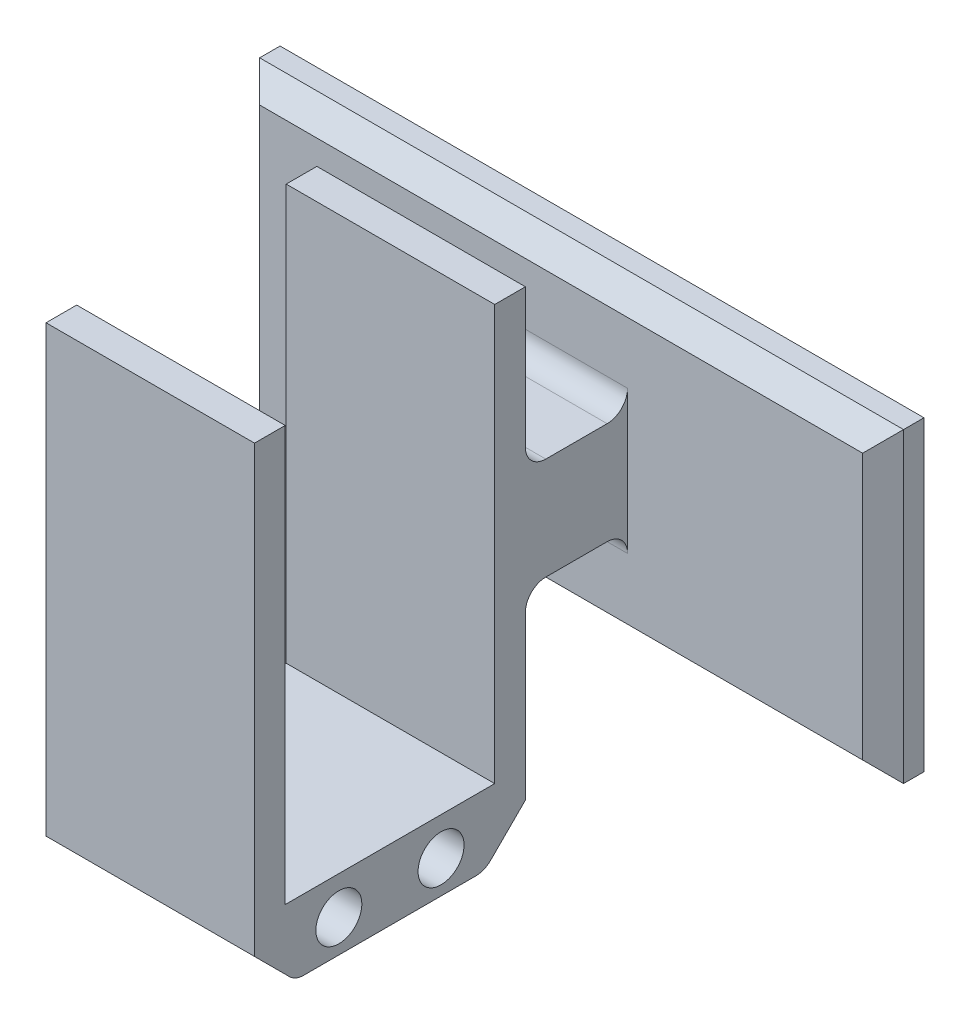
ISO-10303-21;
HEADER;
FILE_DESCRIPTION(('STEP AP214'),'2;1');
FILE_NAME('part.step','',(''),(''),'','','');
FILE_SCHEMA(('AUTOMOTIVE_DESIGN { 1 0 10303 214 1 1 1 1 }'));
ENDSEC;
DATA;
#1=APPLICATION_CONTEXT('core data for automotive mechanical design processes');
#2=APPLICATION_PROTOCOL_DEFINITION('international standard','automotive_design',2000,#1);
#3=PRODUCT_CONTEXT('',#1,'mechanical');
#4=PRODUCT('Part','Part','',(#3));
#5=PRODUCT_RELATED_PRODUCT_CATEGORY('part','',(#4));
#6=PRODUCT_DEFINITION_FORMATION('','',#4);
#7=PRODUCT_DEFINITION_CONTEXT('part definition',#1,'design');
#8=PRODUCT_DEFINITION('design','',#6,#7);
#9=PRODUCT_DEFINITION_SHAPE('','',#8);
#10=(LENGTH_UNIT() NAMED_UNIT(*) SI_UNIT(.MILLI.,.METRE.));
#11=(NAMED_UNIT(*) PLANE_ANGLE_UNIT() SI_UNIT($,.RADIAN.));
#12=(NAMED_UNIT(*) SI_UNIT($,.STERADIAN.) SOLID_ANGLE_UNIT());
#13=UNCERTAINTY_MEASURE_WITH_UNIT(LENGTH_MEASURE(1.E-05),#10,'distance_accuracy_value','');
#14=(GEOMETRIC_REPRESENTATION_CONTEXT(3) GLOBAL_UNCERTAINTY_ASSIGNED_CONTEXT((#13)) GLOBAL_UNIT_ASSIGNED_CONTEXT((#10,
#11,#12)) REPRESENTATION_CONTEXT('',''));
#15=CARTESIAN_POINT('',(0.,0.,0.));
#16=DIRECTION('',(0.,0.,1.));
#17=DIRECTION('',(1.,0.,0.));
#18=AXIS2_PLACEMENT_3D('',#15,#16,#17);
#19=CARTESIAN_POINT('',(20.,0.,-13.25));
#20=DIRECTION('',(0.,0.,1.));
#21=DIRECTION('',(0.,-1.,0.));
#22=AXIS2_PLACEMENT_3D('',#19,#20,#21);
#23=PLANE('',#22);
#24=DIRECTION('',(0.,1.,0.));
#25=VECTOR('',#24,1.);
#26=CARTESIAN_POINT('',(0.,0.,-13.25));
#27=LINE('',#26,#25);
#28=CARTESIAN_POINT('',(0.,6.7,-13.25));
#29=VERTEX_POINT('',#28);
#30=CARTESIAN_POINT('',(0.,20.3,-13.25));
#31=VERTEX_POINT('',#30);
#32=EDGE_CURVE('E361',#29,#31,#27,.T.);
#33=ORIENTED_EDGE('',*,*,#32,.T.);
#34=DIRECTION('',(1.,0.,0.));
#35=VECTOR('',#34,1.);
#36=CARTESIAN_POINT('',(-17.6,20.3,-13.25));
#37=LINE('',#36,#35);
#38=CARTESIAN_POINT('',(20.4,20.3,-13.25));
#39=VERTEX_POINT('',#38);
#40=EDGE_CURVE('E60',#31,#39,#37,.T.);
#41=ORIENTED_EDGE('',*,*,#40,.T.);
#42=DIRECTION('',(0.,1.,0.));
#43=VECTOR('',#42,1.);
#44=CARTESIAN_POINT('',(20.4,6.7,-13.25));
#45=LINE('',#44,#43);
#46=CARTESIAN_POINT('',(20.4,6.7,-13.25));
#47=VERTEX_POINT('',#46);
#48=EDGE_CURVE('E294',#47,#39,#45,.T.);
#49=ORIENTED_EDGE('',*,*,#48,.F.);
#50=DIRECTION('',(1.,0.,0.));
#51=VECTOR('',#50,1.);
#52=CARTESIAN_POINT('',(20.,6.7,-13.25));
#53=LINE('',#52,#51);
#54=EDGE_CURVE('E380',#47,#29,#53,.F.);
#55=ORIENTED_EDGE('',*,*,#54,.T.);
#56=EDGE_LOOP('',(#33,#41,#49,#55));
#57=FACE_BOUND('',#56,.T.);
#58=ADVANCED_FACE('F45',(#57),#23,.F.);
#59=CARTESIAN_POINT('',(0.,-23.1999999999998,-13.25));
#60=VERTEX_POINT('',#59);
#61=CARTESIAN_POINT('',(0.,-7.3,-13.25));
#62=VERTEX_POINT('',#61);
#63=EDGE_CURVE('E362',#60,#62,#27,.T.);
#64=ORIENTED_EDGE('',*,*,#63,.T.);
#65=DIRECTION('',(1.,0.,0.));
#66=VECTOR('',#65,1.);
#67=CARTESIAN_POINT('',(20.,-7.3,-13.25));
#68=LINE('',#67,#66);
#69=CARTESIAN_POINT('',(20.4,-7.3,-13.25));
#70=VERTEX_POINT('',#69);
#71=EDGE_CURVE('E382',#62,#70,#68,.T.);
#72=ORIENTED_EDGE('',*,*,#71,.T.);
#73=DIRECTION('',(0.,1.,0.));
#74=VECTOR('',#73,1.);
#75=CARTESIAN_POINT('',(20.4,-23.1999999999998,-13.25));
#76=LINE('',#75,#74);
#77=CARTESIAN_POINT('',(20.4,-23.1999999999998,-13.25));
#78=VERTEX_POINT('',#77);
#79=EDGE_CURVE('E270',#78,#70,#76,.T.);
#80=ORIENTED_EDGE('',*,*,#79,.F.);
#81=DIRECTION('',(1.,0.,0.));
#82=VECTOR('',#81,1.);
#83=CARTESIAN_POINT('',(-27.3835717173637,-23.1999999999998,-13.25));
#84=LINE('',#83,#82);
#85=EDGE_CURVE('E314',#60,#78,#84,.T.);
#86=ORIENTED_EDGE('',*,*,#85,.F.);
#87=EDGE_LOOP('',(#64,#72,#80,#86));
#88=FACE_BOUND('',#87,.T.);
#89=ADVANCED_FACE('F466',(#88),#23,.F.);
#90=CARTESIAN_POINT('',(20.,0.,13.25));
#91=DIRECTION('',(0.,0.,1.));
#92=DIRECTION('',(1.,0.,0.));
#93=AXIS2_PLACEMENT_3D('',#90,#91,#92);
#94=PLANE('',#93);
#95=DIRECTION('',(1.,0.,0.));
#96=VECTOR('',#95,1.);
#97=CARTESIAN_POINT('',(-17.6,20.3,13.25));
#98=LINE('',#97,#96);
#99=CARTESIAN_POINT('',(0.,20.3,13.25));
#100=VERTEX_POINT('',#99);
#101=CARTESIAN_POINT('',(20.4,20.3,13.25));
#102=VERTEX_POINT('',#101);
#103=EDGE_CURVE('E235',#100,#102,#98,.T.);
#104=ORIENTED_EDGE('',*,*,#103,.F.);
#105=DIRECTION('',(0.,1.,0.));
#106=VECTOR('',#105,1.);
#107=CARTESIAN_POINT('',(0.,0.,13.25));
#108=LINE('',#107,#106);
#109=CARTESIAN_POINT('',(0.,-23.2,13.25));
#110=VERTEX_POINT('',#109);
#111=EDGE_CURVE('E365',#110,#100,#108,.T.);
#112=ORIENTED_EDGE('',*,*,#111,.F.);
#113=DIRECTION('',(1.,0.,0.));
#114=VECTOR('',#113,1.);
#115=CARTESIAN_POINT('',(-27.3835717173637,-23.2,13.25));
#116=LINE('',#115,#114);
#117=CARTESIAN_POINT('',(20.4,-23.2,13.25));
#118=VERTEX_POINT('',#117);
#119=EDGE_CURVE('E304',#110,#118,#116,.T.);
#120=ORIENTED_EDGE('',*,*,#119,.T.);
#121=DIRECTION('',(0.,-1.,0.));
#122=VECTOR('',#121,1.);
#123=CARTESIAN_POINT('',(20.4,20.3,13.25));
#124=LINE('',#123,#122);
#125=EDGE_CURVE('E239',#102,#118,#124,.T.);
#126=ORIENTED_EDGE('',*,*,#125,.F.);
#127=EDGE_LOOP('',(#104,#112,#120,#126));
#128=FACE_BOUND('',#127,.T.);
#129=ADVANCED_FACE('F437',(#128),#94,.T.);
#130=CARTESIAN_POINT('',(20.,0.,10.25));
#131=DIRECTION('',(0.,0.,1.));
#132=DIRECTION('',(1.,0.,0.));
#133=AXIS2_PLACEMENT_3D('',#130,#131,#132);
#134=PLANE('',#133);
#135=DIRECTION('',(0.,1.,0.));
#136=VECTOR('',#135,1.);
#137=CARTESIAN_POINT('',(0.,0.,10.25));
#138=LINE('',#137,#136);
#139=CARTESIAN_POINT('',(0.,-20.3,10.25));
#140=VERTEX_POINT('',#139);
#141=CARTESIAN_POINT('',(0.,20.3,10.25));
#142=VERTEX_POINT('',#141);
#143=EDGE_CURVE('E225',#140,#142,#138,.T.);
#144=ORIENTED_EDGE('',*,*,#143,.T.);
#145=DIRECTION('',(-1.,0.,0.));
#146=VECTOR('',#145,1.);
#147=CARTESIAN_POINT('',(20.,20.3,10.25));
#148=LINE('',#147,#146);
#149=CARTESIAN_POINT('',(20.4,20.3,10.25));
#150=VERTEX_POINT('',#149);
#151=EDGE_CURVE('E218',#150,#142,#148,.T.);
#152=ORIENTED_EDGE('',*,*,#151,.F.);
#153=DIRECTION('',(0.,1.,0.));
#154=VECTOR('',#153,1.);
#155=CARTESIAN_POINT('',(20.4,-20.3,10.25));
#156=LINE('',#155,#154);
#157=CARTESIAN_POINT('',(20.4,-20.3,10.25));
#158=VERTEX_POINT('',#157);
#159=EDGE_CURVE('E223',#158,#150,#156,.T.);
#160=ORIENTED_EDGE('',*,*,#159,.F.);
#161=DIRECTION('',(-1.,0.,0.));
#162=VECTOR('',#161,1.);
#163=CARTESIAN_POINT('',(20.,-20.3,10.25));
#164=LINE('',#163,#162);
#165=EDGE_CURVE('E228',#158,#140,#164,.T.);
#166=ORIENTED_EDGE('',*,*,#165,.T.);
#167=EDGE_LOOP('',(#144,#152,#160,#166));
#168=FACE_BOUND('',#167,.T.);
#169=ADVANCED_FACE('F220',(#168),#134,.F.);
#170=CARTESIAN_POINT('',(20.,0.,-10.25));
#171=DIRECTION('',(0.,0.,1.));
#172=DIRECTION('',(1.,0.,0.));
#173=AXIS2_PLACEMENT_3D('',#170,#171,#172);
#174=PLANE('',#173);
#175=DIRECTION('',(0.,1.,0.));
#176=VECTOR('',#175,1.);
#177=CARTESIAN_POINT('',(0.,0.,-10.25));
#178=LINE('',#177,#176);
#179=CARTESIAN_POINT('',(0.,-20.3,-10.25));
#180=VERTEX_POINT('',#179);
#181=CARTESIAN_POINT('',(0.,20.3,-10.25));
#182=VERTEX_POINT('',#181);
#183=EDGE_CURVE('E369',#180,#182,#178,.T.);
#184=ORIENTED_EDGE('',*,*,#183,.F.);
#185=DIRECTION('',(-1.,0.,0.));
#186=VECTOR('',#185,1.);
#187=CARTESIAN_POINT('',(20.,-20.3,-10.25));
#188=LINE('',#187,#186);
#189=CARTESIAN_POINT('',(20.4,-20.3,-10.25));
#190=VERTEX_POINT('',#189);
#191=EDGE_CURVE('E372',#190,#180,#188,.T.);
#192=ORIENTED_EDGE('',*,*,#191,.F.);
#193=DIRECTION('',(0.,-1.,0.));
#194=VECTOR('',#193,1.);
#195=CARTESIAN_POINT('',(20.4,20.3,-10.25));
#196=LINE('',#195,#194);
#197=CARTESIAN_POINT('',(20.4,20.3,-10.25));
#198=VERTEX_POINT('',#197);
#199=EDGE_CURVE('E300',#198,#190,#196,.T.);
#200=ORIENTED_EDGE('',*,*,#199,.F.);
#201=DIRECTION('',(-1.,0.,0.));
#202=VECTOR('',#201,1.);
#203=CARTESIAN_POINT('',(20.,20.3,-10.25));
#204=LINE('',#203,#202);
#205=EDGE_CURVE('E229',#198,#182,#204,.T.);
#206=ORIENTED_EDGE('',*,*,#205,.T.);
#207=EDGE_LOOP('',(#184,#192,#200,#206));
#208=FACE_BOUND('',#207,.T.);
#209=ADVANCED_FACE('F594',(#208),#174,.T.);
#210=CARTESIAN_POINT('',(0.,0.,0.));
#211=DIRECTION('',(1.,0.,0.));
#212=DIRECTION('',(0.,0.,-1.));
#213=AXIS2_PLACEMENT_3D('',#210,#211,#212);
#214=PLANE('',#213);
#215=ORIENTED_EDGE('',*,*,#111,.T.);
#216=DIRECTION('',(0.,0.,-1.));
#217=VECTOR('',#216,1.);
#218=CARTESIAN_POINT('',(0.,20.3,0.));
#219=LINE('',#218,#217);
#220=EDGE_CURVE('E431',#100,#142,#219,.T.);
#221=ORIENTED_EDGE('',*,*,#220,.T.);
#222=ORIENTED_EDGE('',*,*,#143,.F.);
#223=DIRECTION('',(0.,0.,-1.));
#224=VECTOR('',#223,1.);
#225=CARTESIAN_POINT('',(0.,-20.2999999999998,-13.25));
#226=LINE('',#225,#224);
#227=EDGE_CURVE('E310',#140,#180,#226,.T.);
#228=ORIENTED_EDGE('',*,*,#227,.T.);
#229=ORIENTED_EDGE('',*,*,#183,.T.);
#230=EDGE_CURVE('E430',#182,#31,#219,.T.);
#231=ORIENTED_EDGE('',*,*,#230,.T.);
#232=ORIENTED_EDGE('',*,*,#32,.F.);
#233=CARTESIAN_POINT('',(0.,6.7,-15.25));
#234=DIRECTION('',(1.,0.,0.));
#235=DIRECTION('',(0.,0.,-1.));
#236=AXIS2_PLACEMENT_3D('',#233,#234,#235);
#237=CIRCLE('',#236,2.);
#238=CARTESIAN_POINT('',(0.,4.7,-15.25));
#239=VERTEX_POINT('',#238);
#240=EDGE_CURVE('E387',#29,#239,#237,.T.);
#241=ORIENTED_EDGE('',*,*,#240,.T.);
#242=DIRECTION('',(0.,0.,-1.));
#243=VECTOR('',#242,1.);
#244=CARTESIAN_POINT('',(0.,4.7,-13.25));
#245=LINE('',#244,#243);
#246=CARTESIAN_POINT('',(0.,4.7,-21.25));
#247=VERTEX_POINT('',#246);
#248=EDGE_CURVE('E358',#239,#247,#245,.T.);
#249=ORIENTED_EDGE('',*,*,#248,.T.);
#250=CARTESIAN_POINT('',(0.,6.7,-21.25));
#251=DIRECTION('',(1.,0.,0.));
#252=DIRECTION('',(0.,0.,-1.));
#253=AXIS2_PLACEMENT_3D('',#250,#251,#252);
#254=CIRCLE('',#253,2.);
#255=CARTESIAN_POINT('',(0.,6.7,-23.25));
#256=VERTEX_POINT('',#255);
#257=EDGE_CURVE('E426',#247,#256,#254,.T.);
#258=ORIENTED_EDGE('',*,*,#257,.T.);
#259=DIRECTION('',(0.,-1.,0.));
#260=VECTOR('',#259,1.);
#261=CARTESIAN_POINT('',(0.,4.7,-23.25));
#262=LINE('',#261,#260);
#263=CARTESIAN_POINT('',(0.,-7.3,-23.25));
#264=VERTEX_POINT('',#263);
#265=EDGE_CURVE('E356',#256,#264,#262,.T.);
#266=ORIENTED_EDGE('',*,*,#265,.T.);
#267=CARTESIAN_POINT('',(0.,-7.3,-21.25));
#268=DIRECTION('',(1.,0.,0.));
#269=DIRECTION('',(0.,0.,-1.));
#270=AXIS2_PLACEMENT_3D('',#267,#268,#269);
#271=CIRCLE('',#270,2.);
#272=CARTESIAN_POINT('',(0.,-5.3,-21.25));
#273=VERTEX_POINT('',#272);
#274=EDGE_CURVE('E68',#264,#273,#271,.T.);
#275=ORIENTED_EDGE('',*,*,#274,.T.);
#276=DIRECTION('',(0.,0.,1.));
#277=VECTOR('',#276,1.);
#278=CARTESIAN_POINT('',(0.,-5.3,-23.25));
#279=LINE('',#278,#277);
#280=CARTESIAN_POINT('',(0.,-5.3,-15.25));
#281=VERTEX_POINT('',#280);
#282=EDGE_CURVE('E354',#273,#281,#279,.T.);
#283=ORIENTED_EDGE('',*,*,#282,.T.);
#284=CARTESIAN_POINT('',(0.,-7.3,-15.25));
#285=DIRECTION('',(1.,0.,0.));
#286=DIRECTION('',(0.,0.,-1.));
#287=AXIS2_PLACEMENT_3D('',#284,#285,#286);
#288=CIRCLE('',#287,2.);
#289=EDGE_CURVE('E389',#281,#62,#288,.T.);
#290=ORIENTED_EDGE('',*,*,#289,.T.);
#291=ORIENTED_EDGE('',*,*,#63,.F.);
#292=DIRECTION('',(0.,-0.707106781186554,0.707106781186541));
#293=VECTOR('',#292,1.);
#294=CARTESIAN_POINT('',(0.,-26.6142135623729,-9.83578643762696));
#295=LINE('',#294,#293);
#296=CARTESIAN_POINT('',(0.,-26.6142135623729,-9.83578643762696));
#297=VERTEX_POINT('',#296);
#298=EDGE_CURVE('E318',#60,#297,#295,.T.);
#299=ORIENTED_EDGE('',*,*,#298,.T.);
#300=CARTESIAN_POINT('',(0.,-25.1999999999999,-8.42157287525385));
#301=DIRECTION('',(1.,0.,0.));
#302=DIRECTION('',(0.,0.,-1.));
#303=AXIS2_PLACEMENT_3D('',#300,#301,#302);
#304=CIRCLE('',#303,2.);
#305=CARTESIAN_POINT('',(0.,-27.1999999999999,-8.42157287525387));
#306=VERTEX_POINT('',#305);
#307=EDGE_CURVE('E316',#297,#306,#304,.F.);
#308=ORIENTED_EDGE('',*,*,#307,.T.);
#309=DIRECTION('',(0.,0.,1.));
#310=VECTOR('',#309,1.);
#311=CARTESIAN_POINT('',(0.,-27.1999999999999,-8.42157287525387));
#312=LINE('',#311,#310);
#313=CARTESIAN_POINT('',(0.,-27.2,8.42157287525376));
#314=VERTEX_POINT('',#313);
#315=EDGE_CURVE('E313',#306,#314,#312,.T.);
#316=ORIENTED_EDGE('',*,*,#315,.T.);
#317=CARTESIAN_POINT('',(0.,-25.2,8.42157287525377));
#318=DIRECTION('',(1.,0.,0.));
#319=DIRECTION('',(0.,0.,-1.));
#320=AXIS2_PLACEMENT_3D('',#317,#318,#319);
#321=CIRCLE('',#320,2.);
#322=CARTESIAN_POINT('',(0.,-26.6142135623731,9.83578643762685));
#323=VERTEX_POINT('',#322);
#324=EDGE_CURVE('E311',#314,#323,#321,.F.);
#325=ORIENTED_EDGE('',*,*,#324,.T.);
#326=DIRECTION('',(0.,0.707106781186541,0.707106781186554));
#327=VECTOR('',#326,1.);
#328=CARTESIAN_POINT('',(0.,-23.2,13.25));
#329=LINE('',#328,#327);
#330=EDGE_CURVE('E306',#323,#110,#329,.T.);
#331=ORIENTED_EDGE('',*,*,#330,.T.);
#332=EDGE_LOOP('',(#215,#221,#222,#228,#229,#231,#232,#241,#249,#258,#266,#275,#283,#290,#291,
#299,#308,#316,#325,#331));
#333=FACE_BOUND('',#332,.T.);
#334=ADVANCED_FACE('F435',(#333),#214,.F.);
#335=CARTESIAN_POINT('',(-14.142135623731,-5.3,-23.25));
#336=DIRECTION('',(0.,-1.,0.));
#337=DIRECTION('',(0.,0.,-1.));
#338=AXIS2_PLACEMENT_3D('',#335,#336,#337);
#339=PLANE('',#338);
#340=ORIENTED_EDGE('',*,*,#282,.F.);
#341=DIRECTION('',(1.,0.,0.));
#342=VECTOR('',#341,1.);
#343=CARTESIAN_POINT('',(-14.142135623731,-5.3,-21.25));
#344=LINE('',#343,#342);
#345=CARTESIAN_POINT('',(20.4,-5.3,-21.25));
#346=VERTEX_POINT('',#345);
#347=EDGE_CURVE('E424',#273,#346,#344,.T.);
#348=ORIENTED_EDGE('',*,*,#347,.T.);
#349=DIRECTION('',(0.,0.,-1.));
#350=VECTOR('',#349,1.);
#351=CARTESIAN_POINT('',(20.4,-5.3,-15.25));
#352=LINE('',#351,#350);
#353=CARTESIAN_POINT('',(20.4,-5.3,-15.25));
#354=VERTEX_POINT('',#353);
#355=EDGE_CURVE('E276',#354,#346,#352,.T.);
#356=ORIENTED_EDGE('',*,*,#355,.F.);
#357=DIRECTION('',(1.,0.,0.));
#358=VECTOR('',#357,1.);
#359=CARTESIAN_POINT('',(-14.142135623731,-5.3,-15.25));
#360=LINE('',#359,#358);
#361=EDGE_CURVE('E384',#354,#281,#360,.F.);
#362=ORIENTED_EDGE('',*,*,#361,.T.);
#363=EDGE_LOOP('',(#340,#348,#356,#362));
#364=FACE_BOUND('',#363,.T.);
#365=ADVANCED_FACE('F474',(#364),#339,.T.);
#366=CARTESIAN_POINT('',(-14.142135623731,4.7,-13.25));
#367=DIRECTION('',(0.,1.,0.));
#368=DIRECTION('',(0.,0.,1.));
#369=AXIS2_PLACEMENT_3D('',#366,#367,#368);
#370=PLANE('',#369);
#371=DIRECTION('',(1.,0.,0.));
#372=VECTOR('',#371,1.);
#373=CARTESIAN_POINT('',(-14.142135623731,4.7,-15.25));
#374=LINE('',#373,#372);
#375=CARTESIAN_POINT('',(20.4,4.7,-15.25));
#376=VERTEX_POINT('',#375);
#377=EDGE_CURVE('E378',#239,#376,#374,.T.);
#378=ORIENTED_EDGE('',*,*,#377,.T.);
#379=DIRECTION('',(0.,0.,1.));
#380=VECTOR('',#379,1.);
#381=CARTESIAN_POINT('',(20.4,4.7,-21.25));
#382=LINE('',#381,#380);
#383=CARTESIAN_POINT('',(20.4,4.7,-21.25));
#384=VERTEX_POINT('',#383);
#385=EDGE_CURVE('E288',#384,#376,#382,.T.);
#386=ORIENTED_EDGE('',*,*,#385,.F.);
#387=DIRECTION('',(1.,0.,0.));
#388=VECTOR('',#387,1.);
#389=CARTESIAN_POINT('',(-14.142135623731,4.7,-21.25));
#390=LINE('',#389,#388);
#391=EDGE_CURVE('E422',#384,#247,#390,.F.);
#392=ORIENTED_EDGE('',*,*,#391,.T.);
#393=ORIENTED_EDGE('',*,*,#248,.F.);
#394=EDGE_LOOP('',(#378,#386,#392,#393));
#395=FACE_BOUND('',#394,.T.);
#396=ADVANCED_FACE('F489',(#395),#370,.T.);
#397=CARTESIAN_POINT('',(-14.142135623731,6.7,-15.25));
#398=DIRECTION('',(1.,0.,0.));
#399=DIRECTION('',(0.,0.,-1.));
#400=AXIS2_PLACEMENT_3D('',#397,#398,#399);
#401=CYLINDRICAL_SURFACE('',#400,2.);
#402=ORIENTED_EDGE('',*,*,#240,.F.);
#403=ORIENTED_EDGE('',*,*,#54,.F.);
#404=CARTESIAN_POINT('',(20.4,6.7,-15.25));
#405=DIRECTION('',(-1.,0.,0.));
#406=DIRECTION('',(0.,0.,-1.));
#407=AXIS2_PLACEMENT_3D('',#404,#405,#406);
#408=CIRCLE('',#407,2.);
#409=EDGE_CURVE('E291',#376,#47,#408,.T.);
#410=ORIENTED_EDGE('',*,*,#409,.F.);
#411=ORIENTED_EDGE('',*,*,#377,.F.);
#412=EDGE_LOOP('',(#402,#403,#410,#411));
#413=FACE_BOUND('',#412,.T.);
#414=ADVANCED_FACE('F495',(#413),#401,.F.);
#415=CARTESIAN_POINT('',(20.,-7.3,-15.25));
#416=DIRECTION('',(1.,0.,0.));
#417=DIRECTION('',(0.,0.,-1.));
#418=AXIS2_PLACEMENT_3D('',#415,#416,#417);
#419=CYLINDRICAL_SURFACE('',#418,2.);
#420=ORIENTED_EDGE('',*,*,#289,.F.);
#421=ORIENTED_EDGE('',*,*,#361,.F.);
#422=CARTESIAN_POINT('',(20.4,-7.3,-15.25));
#423=DIRECTION('',(-1.,0.,0.));
#424=DIRECTION('',(0.,0.,-1.));
#425=AXIS2_PLACEMENT_3D('',#422,#423,#424);
#426=CIRCLE('',#425,2.);
#427=EDGE_CURVE('E273',#70,#354,#426,.T.);
#428=ORIENTED_EDGE('',*,*,#427,.F.);
#429=ORIENTED_EDGE('',*,*,#71,.F.);
#430=EDGE_LOOP('',(#420,#421,#428,#429));
#431=FACE_BOUND('',#430,.T.);
#432=ADVANCED_FACE('F472',(#431),#419,.F.);
#433=CARTESIAN_POINT('',(45.4,14.7,-27.25));
#434=DIRECTION('',(-1.,0.,0.));
#435=DIRECTION('',(0.,0.,1.));
#436=AXIS2_PLACEMENT_3D('',#433,#434,#435);
#437=PLANE('',#436);
#438=DIRECTION('',(0.,0.,1.));
#439=VECTOR('',#438,1.);
#440=CARTESIAN_POINT('',(45.4,14.7,-27.25));
#441=LINE('',#440,#439);
#442=CARTESIAN_POINT('',(45.4,14.7,-27.25));
#443=VERTEX_POINT('',#442);
#444=CARTESIAN_POINT('',(45.4,14.7,-25.25));
#445=VERTEX_POINT('',#444);
#446=EDGE_CURVE('E342',#443,#445,#441,.T.);
#447=ORIENTED_EDGE('',*,*,#446,.T.);
#448=DIRECTION('',(0.,-1.,0.));
#449=VECTOR('',#448,1.);
#450=CARTESIAN_POINT('',(45.4,14.7,-25.25));
#451=LINE('',#450,#449);
#452=CARTESIAN_POINT('',(45.4,-15.3,-25.25));
#453=VERTEX_POINT('',#452);
#454=EDGE_CURVE('E405',#445,#453,#451,.T.);
#455=ORIENTED_EDGE('',*,*,#454,.T.);
#456=DIRECTION('',(0.,0.,1.));
#457=VECTOR('',#456,1.);
#458=CARTESIAN_POINT('',(45.4,-15.3,-27.25));
#459=LINE('',#458,#457);
#460=CARTESIAN_POINT('',(45.4,-15.3,-27.25));
#461=VERTEX_POINT('',#460);
#462=EDGE_CURVE('E351',#461,#453,#459,.T.);
#463=ORIENTED_EDGE('',*,*,#462,.F.);
#464=DIRECTION('',(0.,-1.,0.));
#465=VECTOR('',#464,1.);
#466=CARTESIAN_POINT('',(45.4,14.7,-27.25));
#467=LINE('',#466,#465);
#468=EDGE_CURVE('E332',#443,#461,#467,.T.);
#469=ORIENTED_EDGE('',*,*,#468,.F.);
#470=EDGE_LOOP('',(#447,#455,#463,#469));
#471=FACE_BOUND('',#470,.T.);
#472=ADVANCED_FACE('F511',(#471),#437,.F.);
#473=CARTESIAN_POINT('',(45.4,-15.3,-27.25));
#474=DIRECTION('',(0.,1.,0.));
#475=DIRECTION('',(-1.,0.,0.));
#476=AXIS2_PLACEMENT_3D('',#473,#474,#475);
#477=PLANE('',#476);
#478=ORIENTED_EDGE('',*,*,#462,.T.);
#479=DIRECTION('',(-1.,0.,0.));
#480=VECTOR('',#479,1.);
#481=CARTESIAN_POINT('',(45.4,-15.3,-25.25));
#482=LINE('',#481,#480);
#483=CARTESIAN_POINT('',(-17.6,-15.3,-25.25));
#484=VERTEX_POINT('',#483);
#485=EDGE_CURVE('E403',#453,#484,#482,.T.);
#486=ORIENTED_EDGE('',*,*,#485,.T.);
#487=DIRECTION('',(0.,0.,1.));
#488=VECTOR('',#487,1.);
#489=CARTESIAN_POINT('',(-17.6,-15.3,-27.25));
#490=LINE('',#489,#488);
#491=CARTESIAN_POINT('',(-17.6,-15.3,-27.25));
#492=VERTEX_POINT('',#491);
#493=EDGE_CURVE('E348',#492,#484,#490,.T.);
#494=ORIENTED_EDGE('',*,*,#493,.F.);
#495=DIRECTION('',(-1.,0.,0.));
#496=VECTOR('',#495,1.);
#497=CARTESIAN_POINT('',(45.4,-15.3,-27.25));
#498=LINE('',#497,#496);
#499=EDGE_CURVE('E335',#461,#492,#498,.T.);
#500=ORIENTED_EDGE('',*,*,#499,.F.);
#501=EDGE_LOOP('',(#478,#486,#494,#500));
#502=FACE_BOUND('',#501,.T.);
#503=ADVANCED_FACE('F580',(#502),#477,.F.);
#504=CARTESIAN_POINT('',(-17.6,14.7,-27.25));
#505=DIRECTION('',(1.,0.,0.));
#506=DIRECTION('',(0.,0.,-1.));
#507=AXIS2_PLACEMENT_3D('',#504,#505,#506);
#508=PLANE('',#507);
#509=ORIENTED_EDGE('',*,*,#493,.T.);
#510=DIRECTION('',(0.,1.,0.));
#511=VECTOR('',#510,1.);
#512=CARTESIAN_POINT('',(-17.6,14.7,-25.25));
#513=LINE('',#512,#511);
#514=CARTESIAN_POINT('',(-17.6,14.7,-25.25));
#515=VERTEX_POINT('',#514);
#516=EDGE_CURVE('E391',#484,#515,#513,.T.);
#517=ORIENTED_EDGE('',*,*,#516,.T.);
#518=DIRECTION('',(0.,0.,1.));
#519=VECTOR('',#518,1.);
#520=CARTESIAN_POINT('',(-17.6,14.7,-27.25));
#521=LINE('',#520,#519);
#522=CARTESIAN_POINT('',(-17.6,14.7,-27.25));
#523=VERTEX_POINT('',#522);
#524=EDGE_CURVE('E345',#523,#515,#521,.T.);
#525=ORIENTED_EDGE('',*,*,#524,.F.);
#526=DIRECTION('',(0.,1.,0.));
#527=VECTOR('',#526,1.);
#528=CARTESIAN_POINT('',(-17.6,14.7,-27.25));
#529=LINE('',#528,#527);
#530=EDGE_CURVE('E338',#492,#523,#529,.T.);
#531=ORIENTED_EDGE('',*,*,#530,.F.);
#532=EDGE_LOOP('',(#509,#517,#525,#531));
#533=FACE_BOUND('',#532,.T.);
#534=ADVANCED_FACE('F576',(#533),#508,.F.);
#535=CARTESIAN_POINT('',(45.4,14.7,-27.25));
#536=DIRECTION('',(0.,-1.,0.));
#537=DIRECTION('',(1.,0.,0.));
#538=AXIS2_PLACEMENT_3D('',#535,#536,#537);
#539=PLANE('',#538);
#540=ORIENTED_EDGE('',*,*,#524,.T.);
#541=DIRECTION('',(1.,0.,0.));
#542=VECTOR('',#541,1.);
#543=CARTESIAN_POINT('',(45.4,14.7,-25.25));
#544=LINE('',#543,#542);
#545=EDGE_CURVE('E407',#515,#445,#544,.T.);
#546=ORIENTED_EDGE('',*,*,#545,.T.);
#547=ORIENTED_EDGE('',*,*,#446,.F.);
#548=DIRECTION('',(1.,0.,0.));
#549=VECTOR('',#548,1.);
#550=CARTESIAN_POINT('',(45.4,14.7,-27.25));
#551=LINE('',#550,#549);
#552=EDGE_CURVE('E340',#523,#443,#551,.T.);
#553=ORIENTED_EDGE('',*,*,#552,.F.);
#554=EDGE_LOOP('',(#540,#546,#547,#553));
#555=FACE_BOUND('',#554,.T.);
#556=ADVANCED_FACE('F569',(#555),#539,.F.);
#557=CARTESIAN_POINT('',(0.,0.,-27.25));
#558=DIRECTION('',(0.,0.,-1.));
#559=DIRECTION('',(-1.,0.,0.));
#560=AXIS2_PLACEMENT_3D('',#557,#558,#559);
#561=PLANE('',#560);
#562=ORIENTED_EDGE('',*,*,#468,.T.);
#563=ORIENTED_EDGE('',*,*,#499,.T.);
#564=ORIENTED_EDGE('',*,*,#530,.T.);
#565=ORIENTED_EDGE('',*,*,#552,.T.);
#566=EDGE_LOOP('',(#562,#563,#564,#565));
#567=FACE_BOUND('',#566,.T.);
#568=ADVANCED_FACE('F566',(#567),#561,.T.);
#569=CARTESIAN_POINT('',(0.,0.,-23.25));
#570=DIRECTION('',(0.,0.,-1.));
#571=DIRECTION('',(-1.,0.,0.));
#572=AXIS2_PLACEMENT_3D('',#569,#570,#571);
#573=PLANE('',#572);
#574=DIRECTION('',(-1.,0.,0.));
#575=VECTOR('',#574,1.);
#576=CARTESIAN_POINT('',(0.,12.7,-23.25));
#577=LINE('',#576,#575);
#578=CARTESIAN_POINT('',(43.4,12.7,-23.25));
#579=VERTEX_POINT('',#578);
#580=CARTESIAN_POINT('',(-15.6,12.7,-23.25));
#581=VERTEX_POINT('',#580);
#582=EDGE_CURVE('E394',#579,#581,#577,.T.);
#583=ORIENTED_EDGE('',*,*,#582,.T.);
#584=DIRECTION('',(0.,-1.,0.));
#585=VECTOR('',#584,1.);
#586=CARTESIAN_POINT('',(-15.6,0.,-23.25));
#587=LINE('',#586,#585);
#588=CARTESIAN_POINT('',(-15.6,-13.3,-23.25));
#589=VERTEX_POINT('',#588);
#590=EDGE_CURVE('E400',#581,#589,#587,.T.);
#591=ORIENTED_EDGE('',*,*,#590,.T.);
#592=DIRECTION('',(1.,0.,0.));
#593=VECTOR('',#592,1.);
#594=CARTESIAN_POINT('',(0.,-13.3,-23.25));
#595=LINE('',#594,#593);
#596=CARTESIAN_POINT('',(43.4,-13.3,-23.25));
#597=VERTEX_POINT('',#596);
#598=EDGE_CURVE('E398',#589,#597,#595,.T.);
#599=ORIENTED_EDGE('',*,*,#598,.T.);
#600=DIRECTION('',(0.,1.,0.));
#601=VECTOR('',#600,1.);
#602=CARTESIAN_POINT('',(43.4,0.,-23.25));
#603=LINE('',#602,#601);
#604=EDGE_CURVE('E396',#597,#579,#603,.T.);
#605=ORIENTED_EDGE('',*,*,#604,.T.);
#606=EDGE_LOOP('',(#583,#591,#599,#605));
#607=FACE_BOUND('',#606,.T.);
#608=DIRECTION('',(0.,1.,0.));
#609=VECTOR('',#608,1.);
#610=CARTESIAN_POINT('',(20.4,-7.3,-23.25));
#611=LINE('',#610,#609);
#612=CARTESIAN_POINT('',(20.4,-7.3,-23.25));
#613=VERTEX_POINT('',#612);
#614=CARTESIAN_POINT('',(20.4,6.7,-23.25));
#615=VERTEX_POINT('',#614);
#616=EDGE_CURVE('E282',#613,#615,#611,.T.);
#617=ORIENTED_EDGE('',*,*,#616,.F.);
#618=DIRECTION('',(1.,0.,0.));
#619=VECTOR('',#618,1.);
#620=CARTESIAN_POINT('',(0.,-7.3,-23.25));
#621=LINE('',#620,#619);
#622=EDGE_CURVE('E409',#613,#264,#621,.F.);
#623=ORIENTED_EDGE('',*,*,#622,.T.);
#624=ORIENTED_EDGE('',*,*,#265,.F.);
#625=DIRECTION('',(1.,0.,0.));
#626=VECTOR('',#625,1.);
#627=CARTESIAN_POINT('',(0.,6.7,-23.25));
#628=LINE('',#627,#626);
#629=EDGE_CURVE('E420',#256,#615,#628,.T.);
#630=ORIENTED_EDGE('',*,*,#629,.T.);
#631=EDGE_LOOP('',(#617,#623,#624,#630));
#632=FACE_BOUND('',#631,.T.);
#633=ADVANCED_FACE('F480',(#607,#632),#573,.F.);
#634=CARTESIAN_POINT('',(45.4,14.7,-25.25));
#635=DIRECTION('',(-0.707106781186545,0.,-0.70710678118655));
#636=DIRECTION('',(0.,-1.,0.));
#637=AXIS2_PLACEMENT_3D('',#634,#635,#636);
#638=PLANE('',#637);
#639=DIRECTION('',(0.577350269189627,0.577350269189627,-0.577350269189623));
#640=VECTOR('',#639,1.);
#641=CARTESIAN_POINT('',(45.4,14.7,-25.25));
#642=LINE('',#641,#640);
#643=EDGE_CURVE('E413',#579,#445,#642,.T.);
#644=ORIENTED_EDGE('',*,*,#643,.F.);
#645=ORIENTED_EDGE('',*,*,#604,.F.);
#646=DIRECTION('',(0.577350269189627,-0.577350269189627,-0.577350269189623));
#647=VECTOR('',#646,1.);
#648=CARTESIAN_POINT('',(35.3999999999999,-5.29999999999996,-15.25));
#649=LINE('',#648,#647);
#650=EDGE_CURVE('E336',#453,#597,#649,.F.);
#651=ORIENTED_EDGE('',*,*,#650,.F.);
#652=ORIENTED_EDGE('',*,*,#454,.F.);
#653=EDGE_LOOP('',(#644,#645,#651,#652));
#654=FACE_BOUND('',#653,.T.);
#655=ADVANCED_FACE('F533',(#654),#638,.F.);
#656=CARTESIAN_POINT('',(45.4,-15.3,-25.25));
#657=DIRECTION('',(0.,0.707106781186545,-0.70710678118655));
#658=DIRECTION('',(-1.,0.,0.));
#659=AXIS2_PLACEMENT_3D('',#656,#657,#658);
#660=PLANE('',#659);
#661=ORIENTED_EDGE('',*,*,#650,.T.);
#662=ORIENTED_EDGE('',*,*,#598,.F.);
#663=DIRECTION('',(-0.577350269189627,-0.577350269189627,-0.577350269189623));
#664=VECTOR('',#663,1.);
#665=CARTESIAN_POINT('',(3.40000000000009,5.7000000000001,-4.25000000000005));
#666=LINE('',#665,#664);
#667=EDGE_CURVE('E411',#484,#589,#666,.F.);
#668=ORIENTED_EDGE('',*,*,#667,.F.);
#669=ORIENTED_EDGE('',*,*,#485,.F.);
#670=EDGE_LOOP('',(#661,#662,#668,#669));
#671=FACE_BOUND('',#670,.T.);
#672=ADVANCED_FACE('F526',(#671),#660,.F.);
#673=CARTESIAN_POINT('',(45.4,14.7,-25.25));
#674=DIRECTION('',(0.,-0.707106781186545,-0.70710678118655));
#675=DIRECTION('',(1.,0.,0.));
#676=AXIS2_PLACEMENT_3D('',#673,#674,#675);
#677=PLANE('',#676);
#678=ORIENTED_EDGE('',*,*,#643,.T.);
#679=ORIENTED_EDGE('',*,*,#545,.F.);
#680=DIRECTION('',(0.577350269189627,-0.577350269189627,0.577350269189623));
#681=VECTOR('',#680,1.);
#682=CARTESIAN_POINT('',(3.40000000000009,-6.3000000000001,-4.25000000000006));
#683=LINE('',#682,#681);
#684=EDGE_CURVE('E309',#581,#515,#683,.F.);
#685=ORIENTED_EDGE('',*,*,#684,.F.);
#686=ORIENTED_EDGE('',*,*,#582,.F.);
#687=EDGE_LOOP('',(#678,#679,#685,#686));
#688=FACE_BOUND('',#687,.T.);
#689=ADVANCED_FACE('F519',(#688),#677,.F.);
#690=CARTESIAN_POINT('',(-17.6,14.7,-25.25));
#691=DIRECTION('',(0.707106781186545,0.,-0.70710678118655));
#692=DIRECTION('',(0.,1.,0.));
#693=AXIS2_PLACEMENT_3D('',#690,#691,#692);
#694=PLANE('',#693);
#695=ORIENTED_EDGE('',*,*,#667,.T.);
#696=ORIENTED_EDGE('',*,*,#590,.F.);
#697=ORIENTED_EDGE('',*,*,#684,.T.);
#698=ORIENTED_EDGE('',*,*,#516,.F.);
#699=EDGE_LOOP('',(#695,#696,#697,#698));
#700=FACE_BOUND('',#699,.T.);
#701=ADVANCED_FACE('F513',(#700),#694,.F.);
#702=CARTESIAN_POINT('',(0.,6.7,-21.25));
#703=DIRECTION('',(1.,0.,0.));
#704=DIRECTION('',(0.,0.,-1.));
#705=AXIS2_PLACEMENT_3D('',#702,#703,#704);
#706=CYLINDRICAL_SURFACE('',#705,2.);
#707=ORIENTED_EDGE('',*,*,#257,.F.);
#708=ORIENTED_EDGE('',*,*,#391,.F.);
#709=CARTESIAN_POINT('',(20.4,6.7,-21.25));
#710=DIRECTION('',(-1.,0.,0.));
#711=DIRECTION('',(0.,0.,-1.));
#712=AXIS2_PLACEMENT_3D('',#709,#710,#711);
#713=CIRCLE('',#712,2.);
#714=EDGE_CURVE('E285',#615,#384,#713,.T.);
#715=ORIENTED_EDGE('',*,*,#714,.F.);
#716=ORIENTED_EDGE('',*,*,#629,.F.);
#717=EDGE_LOOP('',(#707,#708,#715,#716));
#718=FACE_BOUND('',#717,.T.);
#719=ADVANCED_FACE('F486',(#718),#706,.F.);
#720=CARTESIAN_POINT('',(-14.142135623731,-7.3,-21.25));
#721=DIRECTION('',(1.,0.,0.));
#722=DIRECTION('',(0.,0.,-1.));
#723=AXIS2_PLACEMENT_3D('',#720,#721,#722);
#724=CYLINDRICAL_SURFACE('',#723,2.);
#725=ORIENTED_EDGE('',*,*,#274,.F.);
#726=ORIENTED_EDGE('',*,*,#622,.F.);
#727=CARTESIAN_POINT('',(20.4,-7.3,-21.25));
#728=DIRECTION('',(-1.,0.,0.));
#729=DIRECTION('',(0.,0.,-1.));
#730=AXIS2_PLACEMENT_3D('',#727,#728,#729);
#731=CIRCLE('',#730,2.);
#732=EDGE_CURVE('E279',#346,#613,#731,.T.);
#733=ORIENTED_EDGE('',*,*,#732,.F.);
#734=ORIENTED_EDGE('',*,*,#347,.F.);
#735=EDGE_LOOP('',(#725,#726,#733,#734));
#736=FACE_BOUND('',#735,.T.);
#737=ADVANCED_FACE('F47',(#736),#724,.F.);
#738=CARTESIAN_POINT('',(-27.3835717173637,-20.2999999999998,-13.25));
#739=DIRECTION('',(0.,1.,0.));
#740=DIRECTION('',(0.,0.,1.));
#741=AXIS2_PLACEMENT_3D('',#738,#739,#740);
#742=PLANE('',#741);
#743=ORIENTED_EDGE('',*,*,#165,.F.);
#744=DIRECTION('',(0.,0.,1.));
#745=VECTOR('',#744,1.);
#746=CARTESIAN_POINT('',(20.4,-20.3,-10.25));
#747=LINE('',#746,#745);
#748=EDGE_CURVE('E246',#190,#158,#747,.T.);
#749=ORIENTED_EDGE('',*,*,#748,.F.);
#750=ORIENTED_EDGE('',*,*,#191,.T.);
#751=ORIENTED_EDGE('',*,*,#227,.F.);
#752=EDGE_LOOP('',(#743,#749,#750,#751));
#753=FACE_BOUND('',#752,.T.);
#754=ADVANCED_FACE('F543',(#753),#742,.T.);
#755=CARTESIAN_POINT('',(-27.3835717173637,-23.2,13.25));
#756=DIRECTION('',(0.,-0.707106781186554,0.707106781186541));
#757=DIRECTION('',(0.,-0.707106781186541,-0.707106781186554));
#758=AXIS2_PLACEMENT_3D('',#755,#756,#757);
#759=PLANE('',#758);
#760=ORIENTED_EDGE('',*,*,#330,.F.);
#761=DIRECTION('',(1.,0.,0.));
#762=VECTOR('',#761,1.);
#763=CARTESIAN_POINT('',(-27.3835717173637,-26.6142135623731,9.83578643762685));
#764=LINE('',#763,#762);
#765=CARTESIAN_POINT('',(20.4,-26.6142135623731,9.83578643762685));
#766=VERTEX_POINT('',#765);
#767=EDGE_CURVE('E329',#323,#766,#764,.T.);
#768=ORIENTED_EDGE('',*,*,#767,.T.);
#769=DIRECTION('',(0.,-0.707106781186541,-0.707106781186554));
#770=VECTOR('',#769,1.);
#771=CARTESIAN_POINT('',(20.4,-23.2,13.25));
#772=LINE('',#771,#770);
#773=EDGE_CURVE('E255',#118,#766,#772,.T.);
#774=ORIENTED_EDGE('',*,*,#773,.F.);
#775=ORIENTED_EDGE('',*,*,#119,.F.);
#776=EDGE_LOOP('',(#760,#768,#774,#775));
#777=FACE_BOUND('',#776,.T.);
#778=ADVANCED_FACE('F443',(#777),#759,.T.);
#779=CARTESIAN_POINT('',(-27.3835717173637,-25.2,8.42157287525377));
#780=DIRECTION('',(1.,0.,0.));
#781=DIRECTION('',(0.,0.,-1.));
#782=AXIS2_PLACEMENT_3D('',#779,#780,#781);
#783=CYLINDRICAL_SURFACE('',#782,2.);
#784=ORIENTED_EDGE('',*,*,#324,.F.);
#785=DIRECTION('',(1.,0.,0.));
#786=VECTOR('',#785,1.);
#787=CARTESIAN_POINT('',(-27.3835717173637,-27.2,8.42157287525376));
#788=LINE('',#787,#786);
#789=CARTESIAN_POINT('',(20.4,-27.2,8.42157287525376));
#790=VERTEX_POINT('',#789);
#791=EDGE_CURVE('E327',#314,#790,#788,.T.);
#792=ORIENTED_EDGE('',*,*,#791,.T.);
#793=CARTESIAN_POINT('',(20.4,-25.2,8.42157287525377));
#794=DIRECTION('',(1.,0.,0.));
#795=DIRECTION('',(0.,0.,-1.));
#796=AXIS2_PLACEMENT_3D('',#793,#794,#795);
#797=CIRCLE('',#796,2.);
#798=EDGE_CURVE('E258',#766,#790,#797,.T.);
#799=ORIENTED_EDGE('',*,*,#798,.F.);
#800=ORIENTED_EDGE('',*,*,#767,.F.);
#801=EDGE_LOOP('',(#784,#792,#799,#800));
#802=FACE_BOUND('',#801,.T.);
#803=ADVANCED_FACE('F447',(#802),#783,.T.);
#804=CARTESIAN_POINT('',(-27.3835717173637,-27.1999999999999,-8.42157287525387));
#805=DIRECTION('',(0.,-1.,0.));
#806=DIRECTION('',(0.,0.,-1.));
#807=AXIS2_PLACEMENT_3D('',#804,#805,#806);
#808=PLANE('',#807);
#809=ORIENTED_EDGE('',*,*,#315,.F.);
#810=DIRECTION('',(1.,0.,0.));
#811=VECTOR('',#810,1.);
#812=CARTESIAN_POINT('',(-27.3835717173637,-27.1999999999999,-8.42157287525387));
#813=LINE('',#812,#811);
#814=CARTESIAN_POINT('',(20.4,-27.1999999999999,-8.42157287525387));
#815=VERTEX_POINT('',#814);
#816=EDGE_CURVE('E325',#306,#815,#813,.T.);
#817=ORIENTED_EDGE('',*,*,#816,.T.);
#818=DIRECTION('',(0.,0.,-1.));
#819=VECTOR('',#818,1.);
#820=CARTESIAN_POINT('',(20.4,-27.2,8.42157287525376));
#821=LINE('',#820,#819);
#822=EDGE_CURVE('E261',#790,#815,#821,.T.);
#823=ORIENTED_EDGE('',*,*,#822,.F.);
#824=ORIENTED_EDGE('',*,*,#791,.F.);
#825=EDGE_LOOP('',(#809,#817,#823,#824));
#826=FACE_BOUND('',#825,.T.);
#827=ADVANCED_FACE('F453',(#826),#808,.T.);
#828=CARTESIAN_POINT('',(-27.3835717173637,-25.1999999999999,-8.42157287525385));
#829=DIRECTION('',(1.,0.,0.));
#830=DIRECTION('',(0.,0.,-1.));
#831=AXIS2_PLACEMENT_3D('',#828,#829,#830);
#832=CYLINDRICAL_SURFACE('',#831,2.);
#833=ORIENTED_EDGE('',*,*,#307,.F.);
#834=DIRECTION('',(1.,0.,0.));
#835=VECTOR('',#834,1.);
#836=CARTESIAN_POINT('',(-27.3835717173637,-26.6142135623729,-9.83578643762696));
#837=LINE('',#836,#835);
#838=CARTESIAN_POINT('',(20.4,-26.6142135623729,-9.83578643762695));
#839=VERTEX_POINT('',#838);
#840=EDGE_CURVE('E323',#297,#839,#837,.T.);
#841=ORIENTED_EDGE('',*,*,#840,.T.);
#842=CARTESIAN_POINT('',(20.4,-25.1999999999999,-8.42157287525385));
#843=DIRECTION('',(1.,0.,0.));
#844=DIRECTION('',(0.,0.,-1.));
#845=AXIS2_PLACEMENT_3D('',#842,#843,#844);
#846=CIRCLE('',#845,2.);
#847=EDGE_CURVE('E264',#815,#839,#846,.T.);
#848=ORIENTED_EDGE('',*,*,#847,.F.);
#849=ORIENTED_EDGE('',*,*,#816,.F.);
#850=EDGE_LOOP('',(#833,#841,#848,#849));
#851=FACE_BOUND('',#850,.T.);
#852=ADVANCED_FACE('F457',(#851),#832,.T.);
#853=CARTESIAN_POINT('',(-27.3835717173637,-26.6142135623729,-9.83578643762696));
#854=DIRECTION('',(0.,-0.707106781186541,-0.707106781186554));
#855=DIRECTION('',(0.,0.707106781186554,-0.707106781186541));
#856=AXIS2_PLACEMENT_3D('',#853,#854,#855);
#857=PLANE('',#856);
#858=ORIENTED_EDGE('',*,*,#298,.F.);
#859=ORIENTED_EDGE('',*,*,#85,.T.);
#860=DIRECTION('',(0.,0.707106781186554,-0.707106781186541));
#861=VECTOR('',#860,1.);
#862=CARTESIAN_POINT('',(20.4,-26.6142135623729,-9.83578643762696));
#863=LINE('',#862,#861);
#864=EDGE_CURVE('E267',#839,#78,#863,.T.);
#865=ORIENTED_EDGE('',*,*,#864,.F.);
#866=ORIENTED_EDGE('',*,*,#840,.F.);
#867=EDGE_LOOP('',(#858,#859,#865,#866));
#868=FACE_BOUND('',#867,.T.);
#869=ADVANCED_FACE('F463',(#868),#857,.T.);
#870=CARTESIAN_POINT('',(-17.6,20.3,13.25));
#871=DIRECTION('',(0.,-1.,0.));
#872=DIRECTION('',(0.,0.,-1.));
#873=AXIS2_PLACEMENT_3D('',#870,#871,#872);
#874=PLANE('',#873);
#875=ORIENTED_EDGE('',*,*,#205,.F.);
#876=DIRECTION('',(0.,0.,1.));
#877=VECTOR('',#876,1.);
#878=CARTESIAN_POINT('',(20.4,20.3,-13.25));
#879=LINE('',#878,#877);
#880=EDGE_CURVE('E297',#39,#198,#879,.T.);
#881=ORIENTED_EDGE('',*,*,#880,.F.);
#882=ORIENTED_EDGE('',*,*,#40,.F.);
#883=ORIENTED_EDGE('',*,*,#230,.F.);
#884=EDGE_LOOP('',(#875,#881,#882,#883));
#885=FACE_BOUND('',#884,.T.);
#886=ADVANCED_FACE('F559',(#885),#874,.F.);
#887=ORIENTED_EDGE('',*,*,#220,.F.);
#888=ORIENTED_EDGE('',*,*,#103,.T.);
#889=DIRECTION('',(0.,0.,1.));
#890=VECTOR('',#889,1.);
#891=CARTESIAN_POINT('',(20.4,20.3,10.25));
#892=LINE('',#891,#890);
#893=EDGE_CURVE('E232',#150,#102,#892,.T.);
#894=ORIENTED_EDGE('',*,*,#893,.F.);
#895=ORIENTED_EDGE('',*,*,#151,.T.);
#896=EDGE_LOOP('',(#887,#888,#894,#895));
#897=FACE_BOUND('',#896,.T.);
#898=ADVANCED_FACE('F233',(#897),#874,.F.);
#899=CARTESIAN_POINT('',(20.4,-25.2,8.42157287525377));
#900=DIRECTION('',(1.,0.,0.));
#901=DIRECTION('',(0.,0.,-1.));
#902=AXIS2_PLACEMENT_3D('',#899,#900,#901);
#903=PLANE('',#902);
#904=CARTESIAN_POINT('',(20.4,-23.9999999999999,-5.00000000000001));
#905=DIRECTION('',(1.,0.,0.));
#906=DIRECTION('',(0.,0.,-1.));
#907=AXIS2_PLACEMENT_3D('',#904,#905,#906);
#908=CIRCLE('',#907,2.25);
#909=CARTESIAN_POINT('',(20.4,-23.9999999999999,-7.25000000000002));
#910=VERTEX_POINT('',#909);
#911=EDGE_CURVE('E247',#910,#910,#908,.T.);
#912=ORIENTED_EDGE('',*,*,#911,.F.);
#913=EDGE_LOOP('',(#912));
#914=FACE_BOUND('',#913,.T.);
#915=ORIENTED_EDGE('',*,*,#159,.T.);
#916=ORIENTED_EDGE('',*,*,#893,.T.);
#917=ORIENTED_EDGE('',*,*,#125,.T.);
#918=ORIENTED_EDGE('',*,*,#773,.T.);
#919=ORIENTED_EDGE('',*,*,#798,.T.);
#920=ORIENTED_EDGE('',*,*,#822,.T.);
#921=ORIENTED_EDGE('',*,*,#847,.T.);
#922=ORIENTED_EDGE('',*,*,#864,.T.);
#923=ORIENTED_EDGE('',*,*,#79,.T.);
#924=ORIENTED_EDGE('',*,*,#427,.T.);
#925=ORIENTED_EDGE('',*,*,#355,.T.);
#926=ORIENTED_EDGE('',*,*,#732,.T.);
#927=ORIENTED_EDGE('',*,*,#616,.T.);
#928=ORIENTED_EDGE('',*,*,#714,.T.);
#929=ORIENTED_EDGE('',*,*,#385,.T.);
#930=ORIENTED_EDGE('',*,*,#409,.T.);
#931=ORIENTED_EDGE('',*,*,#48,.T.);
#932=ORIENTED_EDGE('',*,*,#880,.T.);
#933=ORIENTED_EDGE('',*,*,#199,.T.);
#934=ORIENTED_EDGE('',*,*,#748,.T.);
#935=EDGE_LOOP('',(#915,#916,#917,#918,#919,#920,#921,#922,#923,#924,#925,#926,#927,#928,#929,
#930,#931,#932,#933,#934));
#936=FACE_BOUND('',#935,.T.);
#937=CARTESIAN_POINT('',(20.4,-23.9999999999999,4.99999999999999));
#938=DIRECTION('',(1.,0.,0.));
#939=DIRECTION('',(0.,0.,-1.));
#940=AXIS2_PLACEMENT_3D('',#937,#938,#939);
#941=CIRCLE('',#940,2.25000000000001);
#942=CARTESIAN_POINT('',(20.4,-23.9999999999999,2.74999999999998));
#943=VERTEX_POINT('',#942);
#944=EDGE_CURVE('E250',#943,#943,#941,.T.);
#945=ORIENTED_EDGE('',*,*,#944,.F.);
#946=EDGE_LOOP('',(#945));
#947=FACE_BOUND('',#946,.T.);
#948=ADVANCED_FACE('F242',(#914,#936,#947),#903,.T.);
#949=CARTESIAN_POINT('',(10.,-23.9999999999999,4.99999999999999));
#950=DIRECTION('',(-1.,0.,0.));
#951=DIRECTION('',(0.,0.,1.));
#952=AXIS2_PLACEMENT_3D('',#949,#950,#951);
#953=PLANE('',#952);
#954=CARTESIAN_POINT('',(10.,-23.9999999999999,4.99999999999999));
#955=DIRECTION('',(-1.,0.,0.));
#956=DIRECTION('',(0.,0.,1.));
#957=AXIS2_PLACEMENT_3D('',#954,#955,#956);
#958=CIRCLE('',#957,2.25000000000001);
#959=CARTESIAN_POINT('',(10.,-23.9999999999999,7.24999999999999));
#960=VERTEX_POINT('',#959);
#961=EDGE_CURVE('E11',#960,#960,#958,.F.);
#962=ORIENTED_EDGE('',*,*,#961,.T.);
#963=EDGE_LOOP('',(#962));
#964=FACE_BOUND('',#963,.T.);
#965=ADVANCED_FACE('F620',(#964),#953,.F.);
#966=CARTESIAN_POINT('',(-27.3835717173637,-23.9999999999999,4.99999999999999));
#967=DIRECTION('',(1.,0.,0.));
#968=DIRECTION('',(0.,0.,-1.));
#969=AXIS2_PLACEMENT_3D('',#966,#967,#968);
#970=CYLINDRICAL_SURFACE('',#969,2.25000000000001);
#971=ORIENTED_EDGE('',*,*,#961,.F.);
#972=EDGE_LOOP('',(#971));
#973=FACE_BOUND('',#972,.T.);
#974=ORIENTED_EDGE('',*,*,#944,.T.);
#975=EDGE_LOOP('',(#974));
#976=FACE_BOUND('',#975,.T.);
#977=ADVANCED_FACE('F625',(#973,#976),#970,.F.);
#978=CARTESIAN_POINT('',(10.,-23.9999999999999,-5.00000000000001));
#979=DIRECTION('',(-1.,0.,0.));
#980=DIRECTION('',(0.,0.,1.));
#981=AXIS2_PLACEMENT_3D('',#978,#979,#980);
#982=PLANE('',#981);
#983=CARTESIAN_POINT('',(10.,-23.9999999999999,-5.00000000000001));
#984=DIRECTION('',(-1.,0.,0.));
#985=DIRECTION('',(0.,0.,1.));
#986=AXIS2_PLACEMENT_3D('',#983,#984,#985);
#987=CIRCLE('',#986,2.25);
#988=CARTESIAN_POINT('',(10.,-23.9999999999999,-2.75000000000001));
#989=VERTEX_POINT('',#988);
#990=EDGE_CURVE('E53',#989,#989,#987,.F.);
#991=ORIENTED_EDGE('',*,*,#990,.T.);
#992=EDGE_LOOP('',(#991));
#993=FACE_BOUND('',#992,.T.);
#994=ADVANCED_FACE('F635',(#993),#982,.F.);
#995=CARTESIAN_POINT('',(-27.3835717173637,-23.9999999999999,-5.00000000000001));
#996=DIRECTION('',(1.,0.,0.));
#997=DIRECTION('',(0.,0.,-1.));
#998=AXIS2_PLACEMENT_3D('',#995,#996,#997);
#999=CYLINDRICAL_SURFACE('',#998,2.25);
#1000=ORIENTED_EDGE('',*,*,#990,.F.);
#1001=EDGE_LOOP('',(#1000));
#1002=FACE_BOUND('',#1001,.T.);
#1003=ORIENTED_EDGE('',*,*,#911,.T.);
#1004=EDGE_LOOP('',(#1003));
#1005=FACE_BOUND('',#1004,.T.);
#1006=ADVANCED_FACE('F555',(#1002,#1005),#999,.F.);
#1007=CLOSED_SHELL('',(#58,#89,#129,#169,#209,#334,#365,#396,#414,#432,#472,#503,#534,#556,#568,
#633,#655,#672,#689,#701,#719,#737,#754,#778,#803,#827,#852,#869,#886,#898,#948,#965,#977,#994,#1006));
#1008=MANIFOLD_SOLID_BREP('B2',#1007);
#1009=ADVANCED_BREP_SHAPE_REPRESENTATION('',(#18,#1008),#14);
#1010=SHAPE_DEFINITION_REPRESENTATION(#9,#1009);
ENDSEC;
END-ISO-10303-21;
